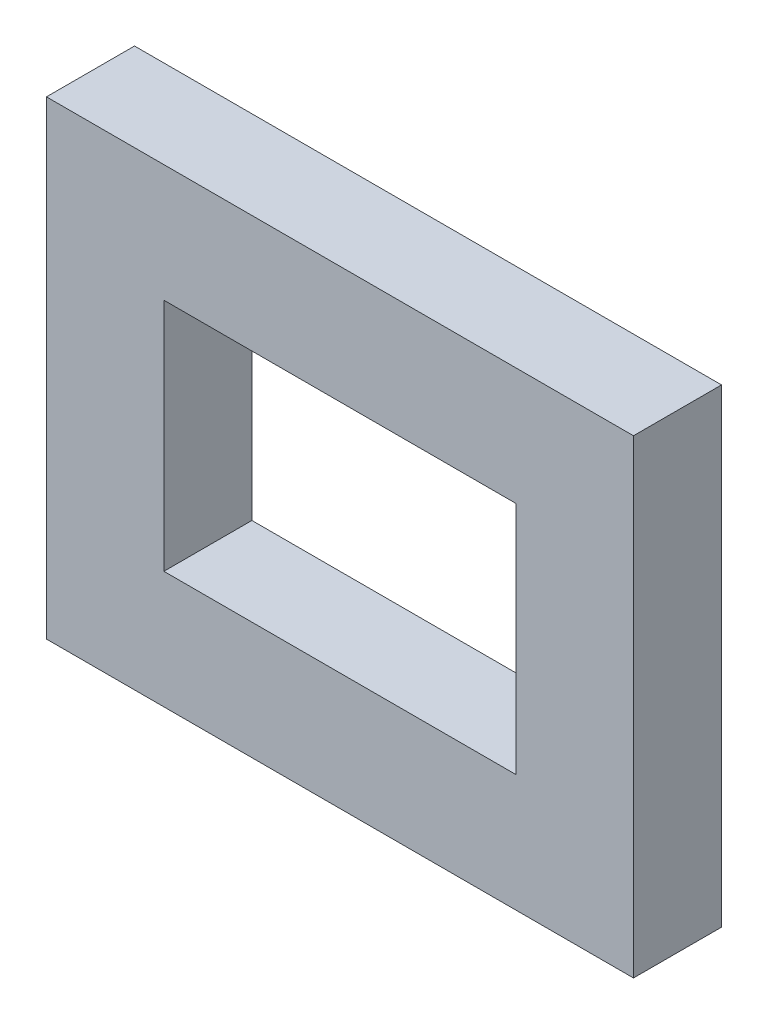
ISO-10303-21;
HEADER;
FILE_DESCRIPTION(('STEP AP214'),'2;1');
FILE_NAME('part.step','',(''),(''),'','','');
FILE_SCHEMA(('AUTOMOTIVE_DESIGN { 1 0 10303 214 1 1 1 1 }'));
ENDSEC;
DATA;
#1=APPLICATION_CONTEXT('core data for automotive mechanical design processes');
#2=APPLICATION_PROTOCOL_DEFINITION('international standard','automotive_design',2000,#1);
#3=PRODUCT_CONTEXT('',#1,'mechanical');
#4=PRODUCT('Part','Part','',(#3));
#5=PRODUCT_RELATED_PRODUCT_CATEGORY('part','',(#4));
#6=PRODUCT_DEFINITION_FORMATION('','',#4);
#7=PRODUCT_DEFINITION_CONTEXT('part definition',#1,'design');
#8=PRODUCT_DEFINITION('design','',#6,#7);
#9=PRODUCT_DEFINITION_SHAPE('','',#8);
#10=(LENGTH_UNIT() NAMED_UNIT(*) SI_UNIT(.MILLI.,.METRE.));
#11=(NAMED_UNIT(*) PLANE_ANGLE_UNIT() SI_UNIT($,.RADIAN.));
#12=(NAMED_UNIT(*) SI_UNIT($,.STERADIAN.) SOLID_ANGLE_UNIT());
#13=UNCERTAINTY_MEASURE_WITH_UNIT(LENGTH_MEASURE(1.E-05),#10,'distance_accuracy_value','');
#14=(GEOMETRIC_REPRESENTATION_CONTEXT(3) GLOBAL_UNCERTAINTY_ASSIGNED_CONTEXT((#13)) GLOBAL_UNIT_ASSIGNED_CONTEXT((#10,
#11,#12)) REPRESENTATION_CONTEXT('',''));
#15=CARTESIAN_POINT('',(0.,0.,0.));
#16=DIRECTION('',(0.,0.,1.));
#17=DIRECTION('',(1.,0.,0.));
#18=AXIS2_PLACEMENT_3D('',#15,#16,#17);
#19=CARTESIAN_POINT('',(0.,0.,3.));
#20=DIRECTION('',(0.,0.,-1.));
#21=DIRECTION('',(-1.,0.,0.));
#22=AXIS2_PLACEMENT_3D('',#19,#20,#21);
#23=PLANE('',#22);
#24=DIRECTION('',(0.,-1.,0.));
#25=VECTOR('',#24,1.);
#26=CARTESIAN_POINT('',(0.,0.,3.));
#27=LINE('',#26,#25);
#28=CARTESIAN_POINT('',(0.,16.,3.));
#29=VERTEX_POINT('',#28);
#30=CARTESIAN_POINT('',(0.,0.,3.));
#31=VERTEX_POINT('',#30);
#32=EDGE_CURVE('E143',#29,#31,#27,.T.);
#33=ORIENTED_EDGE('',*,*,#32,.T.);
#34=DIRECTION('',(1.,0.,0.));
#35=VECTOR('',#34,1.);
#36=CARTESIAN_POINT('',(0.,0.,3.));
#37=LINE('',#36,#35);
#38=CARTESIAN_POINT('',(20.,0.,3.));
#39=VERTEX_POINT('',#38);
#40=EDGE_CURVE('E150',#31,#39,#37,.T.);
#41=ORIENTED_EDGE('',*,*,#40,.T.);
#42=DIRECTION('',(0.,1.,0.));
#43=VECTOR('',#42,1.);
#44=CARTESIAN_POINT('',(20.,0.,3.));
#45=LINE('',#44,#43);
#46=CARTESIAN_POINT('',(20.,16.,3.));
#47=VERTEX_POINT('',#46);
#48=EDGE_CURVE('E148',#39,#47,#45,.T.);
#49=ORIENTED_EDGE('',*,*,#48,.T.);
#50=DIRECTION('',(-1.,0.,0.));
#51=VECTOR('',#50,1.);
#52=CARTESIAN_POINT('',(0.,16.,3.));
#53=LINE('',#52,#51);
#54=EDGE_CURVE('E155',#47,#29,#53,.T.);
#55=ORIENTED_EDGE('',*,*,#54,.T.);
#56=EDGE_LOOP('',(#33,#41,#49,#55));
#57=FACE_BOUND('',#56,.T.);
#58=DIRECTION('',(0.,-1.,0.));
#59=VECTOR('',#58,1.);
#60=CARTESIAN_POINT('',(4.,4.,3.));
#61=LINE('',#60,#59);
#62=CARTESIAN_POINT('',(4.,12.,3.));
#63=VERTEX_POINT('',#62);
#64=CARTESIAN_POINT('',(4.,4.,3.));
#65=VERTEX_POINT('',#64);
#66=EDGE_CURVE('E106',#63,#65,#61,.T.);
#67=ORIENTED_EDGE('',*,*,#66,.F.);
#68=DIRECTION('',(-1.,0.,0.));
#69=VECTOR('',#68,1.);
#70=CARTESIAN_POINT('',(4.,12.,3.));
#71=LINE('',#70,#69);
#72=CARTESIAN_POINT('',(16.,12.,3.));
#73=VERTEX_POINT('',#72);
#74=EDGE_CURVE('E127',#73,#63,#71,.T.);
#75=ORIENTED_EDGE('',*,*,#74,.F.);
#76=DIRECTION('',(0.,1.,0.));
#77=VECTOR('',#76,1.);
#78=CARTESIAN_POINT('',(16.,4.,3.));
#79=LINE('',#78,#77);
#80=CARTESIAN_POINT('',(16.,4.,3.));
#81=VERTEX_POINT('',#80);
#82=EDGE_CURVE('E126',#81,#73,#79,.T.);
#83=ORIENTED_EDGE('',*,*,#82,.F.);
#84=DIRECTION('',(1.,0.,0.));
#85=VECTOR('',#84,1.);
#86=CARTESIAN_POINT('',(4.,4.,3.));
#87=LINE('',#86,#85);
#88=EDGE_CURVE('E118',#65,#81,#87,.T.);
#89=ORIENTED_EDGE('',*,*,#88,.F.);
#90=EDGE_LOOP('',(#67,#75,#83,#89));
#91=FACE_BOUND('',#90,.T.);
#92=ADVANCED_FACE('F43',(#57,#91),#23,.F.);
#93=CARTESIAN_POINT('',(0.,0.,0.));
#94=DIRECTION('',(0.,0.,-1.));
#95=DIRECTION('',(-1.,0.,0.));
#96=AXIS2_PLACEMENT_3D('',#93,#94,#95);
#97=PLANE('',#96);
#98=DIRECTION('',(0.,-1.,0.));
#99=VECTOR('',#98,1.);
#100=CARTESIAN_POINT('',(0.,0.,0.));
#101=LINE('',#100,#99);
#102=CARTESIAN_POINT('',(0.,16.,0.));
#103=VERTEX_POINT('',#102);
#104=CARTESIAN_POINT('',(0.,0.,0.));
#105=VERTEX_POINT('',#104);
#106=EDGE_CURVE('E125',#103,#105,#101,.T.);
#107=ORIENTED_EDGE('',*,*,#106,.F.);
#108=DIRECTION('',(-1.,0.,0.));
#109=VECTOR('',#108,1.);
#110=CARTESIAN_POINT('',(0.,16.,0.));
#111=LINE('',#110,#109);
#112=CARTESIAN_POINT('',(20.,16.,0.));
#113=VERTEX_POINT('',#112);
#114=EDGE_CURVE('E149',#113,#103,#111,.T.);
#115=ORIENTED_EDGE('',*,*,#114,.F.);
#116=DIRECTION('',(0.,1.,0.));
#117=VECTOR('',#116,1.);
#118=CARTESIAN_POINT('',(20.,0.,0.));
#119=LINE('',#118,#117);
#120=CARTESIAN_POINT('',(20.,0.,0.));
#121=VERTEX_POINT('',#120);
#122=EDGE_CURVE('E159',#121,#113,#119,.T.);
#123=ORIENTED_EDGE('',*,*,#122,.F.);
#124=DIRECTION('',(1.,0.,0.));
#125=VECTOR('',#124,1.);
#126=CARTESIAN_POINT('',(0.,0.,0.));
#127=LINE('',#126,#125);
#128=EDGE_CURVE('E160',#105,#121,#127,.T.);
#129=ORIENTED_EDGE('',*,*,#128,.F.);
#130=EDGE_LOOP('',(#107,#115,#123,#129));
#131=FACE_BOUND('',#130,.T.);
#132=DIRECTION('',(-1.,0.,0.));
#133=VECTOR('',#132,1.);
#134=CARTESIAN_POINT('',(4.,12.,0.));
#135=LINE('',#134,#133);
#136=CARTESIAN_POINT('',(16.,12.,0.));
#137=VERTEX_POINT('',#136);
#138=CARTESIAN_POINT('',(4.,12.,0.));
#139=VERTEX_POINT('',#138);
#140=EDGE_CURVE('E120',#137,#139,#135,.T.);
#141=ORIENTED_EDGE('',*,*,#140,.T.);
#142=DIRECTION('',(0.,-1.,0.));
#143=VECTOR('',#142,1.);
#144=CARTESIAN_POINT('',(4.,4.,0.));
#145=LINE('',#144,#143);
#146=CARTESIAN_POINT('',(4.,4.,0.));
#147=VERTEX_POINT('',#146);
#148=EDGE_CURVE('E67',#139,#147,#145,.T.);
#149=ORIENTED_EDGE('',*,*,#148,.T.);
#150=DIRECTION('',(1.,0.,0.));
#151=VECTOR('',#150,1.);
#152=CARTESIAN_POINT('',(4.,4.,0.));
#153=LINE('',#152,#151);
#154=CARTESIAN_POINT('',(16.,4.,0.));
#155=VERTEX_POINT('',#154);
#156=EDGE_CURVE('E121',#147,#155,#153,.T.);
#157=ORIENTED_EDGE('',*,*,#156,.T.);
#158=DIRECTION('',(0.,1.,0.));
#159=VECTOR('',#158,1.);
#160=CARTESIAN_POINT('',(16.,4.,0.));
#161=LINE('',#160,#159);
#162=EDGE_CURVE('E136',#155,#137,#161,.T.);
#163=ORIENTED_EDGE('',*,*,#162,.T.);
#164=EDGE_LOOP('',(#141,#149,#157,#163));
#165=FACE_BOUND('',#164,.T.);
#166=ADVANCED_FACE('F180',(#131,#165),#97,.T.);
#167=CARTESIAN_POINT('',(0.,0.,3.));
#168=DIRECTION('',(1.,0.,0.));
#169=DIRECTION('',(0.,0.,-1.));
#170=AXIS2_PLACEMENT_3D('',#167,#168,#169);
#171=PLANE('',#170);
#172=ORIENTED_EDGE('',*,*,#106,.T.);
#173=DIRECTION('',(0.,0.,-1.));
#174=VECTOR('',#173,1.);
#175=CARTESIAN_POINT('',(0.,0.,3.));
#176=LINE('',#175,#174);
#177=EDGE_CURVE('E11',#31,#105,#176,.T.);
#178=ORIENTED_EDGE('',*,*,#177,.F.);
#179=ORIENTED_EDGE('',*,*,#32,.F.);
#180=DIRECTION('',(0.,0.,-1.));
#181=VECTOR('',#180,1.);
#182=CARTESIAN_POINT('',(0.,16.,3.));
#183=LINE('',#182,#181);
#184=EDGE_CURVE('E152',#29,#103,#183,.T.);
#185=ORIENTED_EDGE('',*,*,#184,.T.);
#186=EDGE_LOOP('',(#172,#178,#179,#185));
#187=FACE_BOUND('',#186,.T.);
#188=ADVANCED_FACE('F44',(#187),#171,.F.);
#189=CARTESIAN_POINT('',(0.,0.,3.));
#190=DIRECTION('',(0.,1.,0.));
#191=DIRECTION('',(0.,0.,1.));
#192=AXIS2_PLACEMENT_3D('',#189,#190,#191);
#193=PLANE('',#192);
#194=ORIENTED_EDGE('',*,*,#128,.T.);
#195=DIRECTION('',(0.,0.,-1.));
#196=VECTOR('',#195,1.);
#197=CARTESIAN_POINT('',(20.,0.,3.));
#198=LINE('',#197,#196);
#199=EDGE_CURVE('E51',#39,#121,#198,.T.);
#200=ORIENTED_EDGE('',*,*,#199,.F.);
#201=ORIENTED_EDGE('',*,*,#40,.F.);
#202=ORIENTED_EDGE('',*,*,#177,.T.);
#203=EDGE_LOOP('',(#194,#200,#201,#202));
#204=FACE_BOUND('',#203,.T.);
#205=ADVANCED_FACE('F190',(#204),#193,.F.);
#206=CARTESIAN_POINT('',(20.,0.,3.));
#207=DIRECTION('',(-1.,0.,0.));
#208=DIRECTION('',(0.,0.,1.));
#209=AXIS2_PLACEMENT_3D('',#206,#207,#208);
#210=PLANE('',#209);
#211=ORIENTED_EDGE('',*,*,#122,.T.);
#212=DIRECTION('',(0.,0.,-1.));
#213=VECTOR('',#212,1.);
#214=CARTESIAN_POINT('',(20.,16.,3.));
#215=LINE('',#214,#213);
#216=EDGE_CURVE('E162',#47,#113,#215,.T.);
#217=ORIENTED_EDGE('',*,*,#216,.F.);
#218=ORIENTED_EDGE('',*,*,#48,.F.);
#219=ORIENTED_EDGE('',*,*,#199,.T.);
#220=EDGE_LOOP('',(#211,#217,#218,#219));
#221=FACE_BOUND('',#220,.T.);
#222=ADVANCED_FACE('F173',(#221),#210,.F.);
#223=CARTESIAN_POINT('',(0.,16.,3.));
#224=DIRECTION('',(0.,-1.,0.));
#225=DIRECTION('',(0.,0.,-1.));
#226=AXIS2_PLACEMENT_3D('',#223,#224,#225);
#227=PLANE('',#226);
#228=ORIENTED_EDGE('',*,*,#114,.T.);
#229=ORIENTED_EDGE('',*,*,#184,.F.);
#230=ORIENTED_EDGE('',*,*,#54,.F.);
#231=ORIENTED_EDGE('',*,*,#216,.T.);
#232=EDGE_LOOP('',(#228,#229,#230,#231));
#233=FACE_BOUND('',#232,.T.);
#234=ADVANCED_FACE('F181',(#233),#227,.F.);
#235=CARTESIAN_POINT('',(4.,4.,3.));
#236=DIRECTION('',(1.,0.,0.));
#237=DIRECTION('',(0.,0.,-1.));
#238=AXIS2_PLACEMENT_3D('',#235,#236,#237);
#239=PLANE('',#238);
#240=ORIENTED_EDGE('',*,*,#148,.F.);
#241=DIRECTION('',(0.,0.,-1.));
#242=VECTOR('',#241,1.);
#243=CARTESIAN_POINT('',(4.,12.,3.));
#244=LINE('',#243,#242);
#245=EDGE_CURVE('E115',#63,#139,#244,.T.);
#246=ORIENTED_EDGE('',*,*,#245,.F.);
#247=ORIENTED_EDGE('',*,*,#66,.T.);
#248=DIRECTION('',(0.,0.,-1.));
#249=VECTOR('',#248,1.);
#250=CARTESIAN_POINT('',(4.,4.,3.));
#251=LINE('',#250,#249);
#252=EDGE_CURVE('E112',#65,#147,#251,.T.);
#253=ORIENTED_EDGE('',*,*,#252,.T.);
#254=EDGE_LOOP('',(#240,#246,#247,#253));
#255=FACE_BOUND('',#254,.T.);
#256=ADVANCED_FACE('F109',(#255),#239,.T.);
#257=CARTESIAN_POINT('',(4.,4.,3.));
#258=DIRECTION('',(0.,1.,0.));
#259=DIRECTION('',(0.,0.,1.));
#260=AXIS2_PLACEMENT_3D('',#257,#258,#259);
#261=PLANE('',#260);
#262=ORIENTED_EDGE('',*,*,#156,.F.);
#263=ORIENTED_EDGE('',*,*,#252,.F.);
#264=ORIENTED_EDGE('',*,*,#88,.T.);
#265=DIRECTION('',(0.,0.,-1.));
#266=VECTOR('',#265,1.);
#267=CARTESIAN_POINT('',(16.,4.,3.));
#268=LINE('',#267,#266);
#269=EDGE_CURVE('E124',#81,#155,#268,.T.);
#270=ORIENTED_EDGE('',*,*,#269,.T.);
#271=EDGE_LOOP('',(#262,#263,#264,#270));
#272=FACE_BOUND('',#271,.T.);
#273=ADVANCED_FACE('F119',(#272),#261,.T.);
#274=CARTESIAN_POINT('',(16.,4.,3.));
#275=DIRECTION('',(-1.,0.,0.));
#276=DIRECTION('',(0.,0.,1.));
#277=AXIS2_PLACEMENT_3D('',#274,#275,#276);
#278=PLANE('',#277);
#279=ORIENTED_EDGE('',*,*,#162,.F.);
#280=ORIENTED_EDGE('',*,*,#269,.F.);
#281=ORIENTED_EDGE('',*,*,#82,.T.);
#282=DIRECTION('',(0.,0.,-1.));
#283=VECTOR('',#282,1.);
#284=CARTESIAN_POINT('',(16.,12.,3.));
#285=LINE('',#284,#283);
#286=EDGE_CURVE('E59',#73,#137,#285,.T.);
#287=ORIENTED_EDGE('',*,*,#286,.T.);
#288=EDGE_LOOP('',(#279,#280,#281,#287));
#289=FACE_BOUND('',#288,.T.);
#290=ADVANCED_FACE('F209',(#289),#278,.T.);
#291=CARTESIAN_POINT('',(4.,12.,3.));
#292=DIRECTION('',(0.,-1.,0.));
#293=DIRECTION('',(0.,0.,-1.));
#294=AXIS2_PLACEMENT_3D('',#291,#292,#293);
#295=PLANE('',#294);
#296=ORIENTED_EDGE('',*,*,#140,.F.);
#297=ORIENTED_EDGE('',*,*,#286,.F.);
#298=ORIENTED_EDGE('',*,*,#74,.T.);
#299=ORIENTED_EDGE('',*,*,#245,.T.);
#300=EDGE_LOOP('',(#296,#297,#298,#299));
#301=FACE_BOUND('',#300,.T.);
#302=ADVANCED_FACE('F215',(#301),#295,.T.);
#303=CLOSED_SHELL('',(#92,#166,#188,#205,#222,#234,#256,#273,#290,#302));
#304=MANIFOLD_SOLID_BREP('B2',#303);
#305=ADVANCED_BREP_SHAPE_REPRESENTATION('',(#18,#304),#14);
#306=SHAPE_DEFINITION_REPRESENTATION(#9,#305);
ENDSEC;
END-ISO-10303-21;
